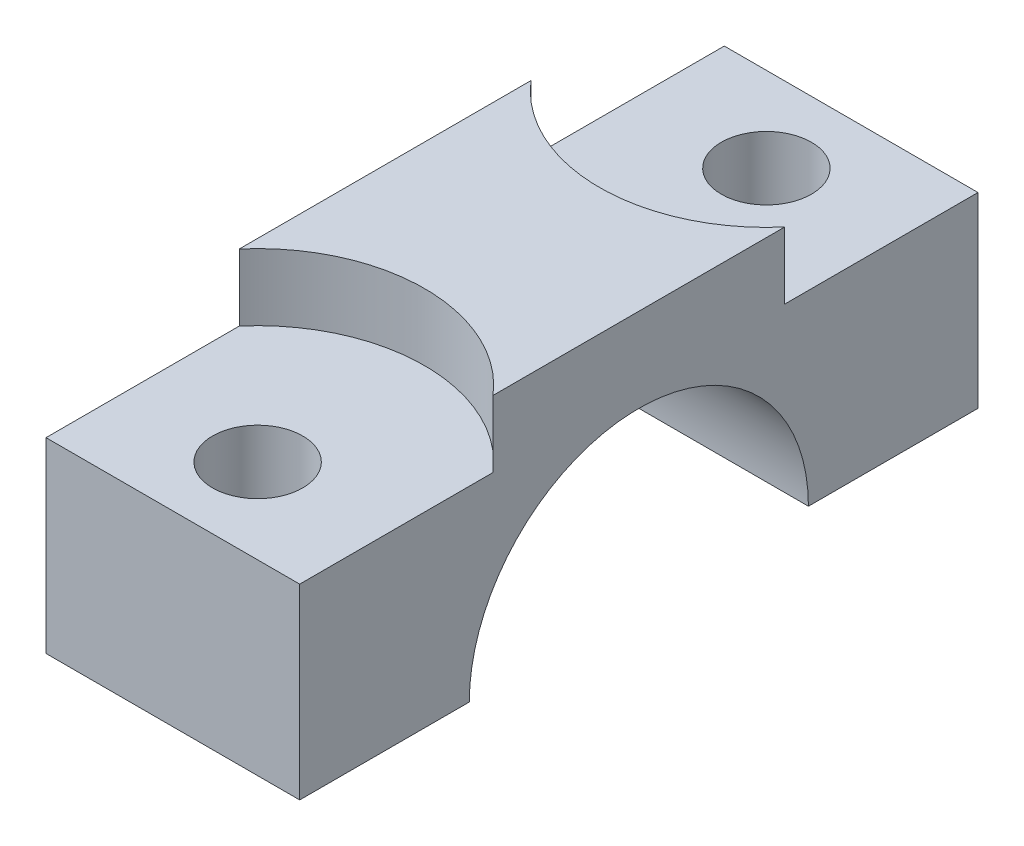
ISO-10303-21;
HEADER;
FILE_DESCRIPTION(('STEP AP214'),'2;1');
FILE_NAME('part.step','',(''),(''),'','','');
FILE_SCHEMA(('AUTOMOTIVE_DESIGN { 1 0 10303 214 1 1 1 1 }'));
ENDSEC;
DATA;
#1=APPLICATION_CONTEXT('core data for automotive mechanical design processes');
#2=APPLICATION_PROTOCOL_DEFINITION('international standard','automotive_design',2000,#1);
#3=PRODUCT_CONTEXT('',#1,'mechanical');
#4=PRODUCT('Part','Part','',(#3));
#5=PRODUCT_RELATED_PRODUCT_CATEGORY('part','',(#4));
#6=PRODUCT_DEFINITION_FORMATION('','',#4);
#7=PRODUCT_DEFINITION_CONTEXT('part definition',#1,'design');
#8=PRODUCT_DEFINITION('design','',#6,#7);
#9=PRODUCT_DEFINITION_SHAPE('','',#8);
#10=(LENGTH_UNIT() NAMED_UNIT(*) SI_UNIT(.MILLI.,.METRE.));
#11=(NAMED_UNIT(*) PLANE_ANGLE_UNIT() SI_UNIT($,.RADIAN.));
#12=(NAMED_UNIT(*) SI_UNIT($,.STERADIAN.) SOLID_ANGLE_UNIT());
#13=UNCERTAINTY_MEASURE_WITH_UNIT(LENGTH_MEASURE(1.E-05),#10,'distance_accuracy_value','');
#14=(GEOMETRIC_REPRESENTATION_CONTEXT(3) GLOBAL_UNCERTAINTY_ASSIGNED_CONTEXT((#13)) GLOBAL_UNIT_ASSIGNED_CONTEXT((#10,
#11,#12)) REPRESENTATION_CONTEXT('',''));
#15=CARTESIAN_POINT('',(0.,0.,0.));
#16=DIRECTION('',(0.,0.,1.));
#17=DIRECTION('',(1.,0.,0.));
#18=AXIS2_PLACEMENT_3D('',#15,#16,#17);
#19=CARTESIAN_POINT('',(9.5,0.,0.));
#20=DIRECTION('',(-1.,0.,0.));
#21=DIRECTION('',(0.,0.,1.));
#22=AXIS2_PLACEMENT_3D('',#19,#20,#21);
#23=CYLINDRICAL_SURFACE('',#22,12.7);
#24=CARTESIAN_POINT('',(-9.5,0.,0.));
#25=DIRECTION('',(1.,0.,0.));
#26=DIRECTION('',(0.,0.,-1.));
#27=AXIS2_PLACEMENT_3D('',#24,#25,#26);
#28=CIRCLE('',#27,12.7);
#29=CARTESIAN_POINT('',(-9.5,0.,-12.7));
#30=VERTEX_POINT('',#29);
#31=CARTESIAN_POINT('',(-9.5,0.,12.7));
#32=VERTEX_POINT('',#31);
#33=EDGE_CURVE('E150',#30,#32,#28,.T.);
#34=ORIENTED_EDGE('',*,*,#33,.F.);
#35=DIRECTION('',(-1.,0.,0.));
#36=VECTOR('',#35,1.);
#37=CARTESIAN_POINT('',(9.5,0.,-12.7));
#38=LINE('',#37,#36);
#39=CARTESIAN_POINT('',(9.5,0.,-12.7));
#40=VERTEX_POINT('',#39);
#41=EDGE_CURVE('E183',#40,#30,#38,.T.);
#42=ORIENTED_EDGE('',*,*,#41,.F.);
#43=CARTESIAN_POINT('',(9.5,0.,0.));
#44=DIRECTION('',(1.,0.,0.));
#45=DIRECTION('',(0.,0.,-1.));
#46=AXIS2_PLACEMENT_3D('',#43,#44,#45);
#47=CIRCLE('',#46,12.7);
#48=CARTESIAN_POINT('',(9.5,0.,12.7));
#49=VERTEX_POINT('',#48);
#50=EDGE_CURVE('E151',#40,#49,#47,.T.);
#51=ORIENTED_EDGE('',*,*,#50,.T.);
#52=DIRECTION('',(-1.,0.,0.));
#53=VECTOR('',#52,1.);
#54=CARTESIAN_POINT('',(9.5,0.,12.7));
#55=LINE('',#54,#53);
#56=EDGE_CURVE('E175',#49,#32,#55,.T.);
#57=ORIENTED_EDGE('',*,*,#56,.T.);
#58=EDGE_LOOP('',(#34,#42,#51,#57));
#59=FACE_BOUND('',#58,.T.);
#60=ADVANCED_FACE('F34',(#59),#23,.F.);
#61=CARTESIAN_POINT('',(9.5,0.,0.));
#62=DIRECTION('',(0.,1.,0.));
#63=DIRECTION('',(0.,0.,1.));
#64=AXIS2_PLACEMENT_3D('',#61,#62,#63);
#65=PLANE('',#64);
#66=CARTESIAN_POINT('',(0.,0.,-19.05));
#67=DIRECTION('',(0.,1.,0.));
#68=DIRECTION('',(0.,0.,1.));
#69=AXIS2_PLACEMENT_3D('',#66,#67,#68);
#70=CIRCLE('',#69,3.375);
#71=CARTESIAN_POINT('',(0.,0.,-15.675));
#72=VERTEX_POINT('',#71);
#73=EDGE_CURVE('E117',#72,#72,#70,.T.);
#74=ORIENTED_EDGE('',*,*,#73,.T.);
#75=EDGE_LOOP('',(#74));
#76=FACE_BOUND('',#75,.T.);
#77=DIRECTION('',(0.,0.,-1.));
#78=VECTOR('',#77,1.);
#79=CARTESIAN_POINT('',(-9.5,0.,0.));
#80=LINE('',#79,#78);
#81=CARTESIAN_POINT('',(-9.5,0.,-25.4));
#82=VERTEX_POINT('',#81);
#83=EDGE_CURVE('E165',#30,#82,#80,.T.);
#84=ORIENTED_EDGE('',*,*,#83,.T.);
#85=DIRECTION('',(-1.,0.,0.));
#86=VECTOR('',#85,1.);
#87=CARTESIAN_POINT('',(9.5,0.,-25.4));
#88=LINE('',#87,#86);
#89=CARTESIAN_POINT('',(9.5,0.,-25.4));
#90=VERTEX_POINT('',#89);
#91=EDGE_CURVE('E180',#90,#82,#88,.T.);
#92=ORIENTED_EDGE('',*,*,#91,.F.);
#93=DIRECTION('',(0.,0.,-1.));
#94=VECTOR('',#93,1.);
#95=CARTESIAN_POINT('',(9.5,0.,0.));
#96=LINE('',#95,#94);
#97=EDGE_CURVE('E154',#40,#90,#96,.T.);
#98=ORIENTED_EDGE('',*,*,#97,.F.);
#99=ORIENTED_EDGE('',*,*,#41,.T.);
#100=EDGE_LOOP('',(#84,#92,#98,#99));
#101=FACE_BOUND('',#100,.T.);
#102=ADVANCED_FACE('F204',(#76,#101),#65,.F.);
#103=CARTESIAN_POINT('',(9.5,0.,-25.4));
#104=DIRECTION('',(0.,0.,-1.));
#105=DIRECTION('',(0.,1.,0.));
#106=AXIS2_PLACEMENT_3D('',#103,#104,#105);
#107=PLANE('',#106);
#108=DIRECTION('',(-1.,0.,0.));
#109=VECTOR('',#108,1.);
#110=CARTESIAN_POINT('',(9.5,14.,-25.4));
#111=LINE('',#110,#109);
#112=CARTESIAN_POINT('',(9.5,14.,-25.4));
#113=VERTEX_POINT('',#112);
#114=CARTESIAN_POINT('',(-9.5,14.,-25.4));
#115=VERTEX_POINT('',#114);
#116=EDGE_CURVE('E116',#113,#115,#111,.T.);
#117=ORIENTED_EDGE('',*,*,#116,.F.);
#118=DIRECTION('',(0.,-1.,0.));
#119=VECTOR('',#118,1.);
#120=CARTESIAN_POINT('',(9.5,0.,-25.4));
#121=LINE('',#120,#119);
#122=EDGE_CURVE('E130',#113,#90,#121,.T.);
#123=ORIENTED_EDGE('',*,*,#122,.T.);
#124=ORIENTED_EDGE('',*,*,#91,.T.);
#125=DIRECTION('',(0.,-1.,0.));
#126=VECTOR('',#125,1.);
#127=CARTESIAN_POINT('',(-9.5,0.,-25.4));
#128=LINE('',#127,#126);
#129=EDGE_CURVE('E168',#115,#82,#128,.T.);
#130=ORIENTED_EDGE('',*,*,#129,.F.);
#131=EDGE_LOOP('',(#117,#123,#124,#130));
#132=FACE_BOUND('',#131,.T.);
#133=ADVANCED_FACE('F224',(#132),#107,.T.);
#134=CARTESIAN_POINT('',(9.5,19.,0.));
#135=DIRECTION('',(0.,1.,0.));
#136=DIRECTION('',(0.,0.,1.));
#137=AXIS2_PLACEMENT_3D('',#134,#135,#136);
#138=PLANE('',#137);
#139=CARTESIAN_POINT('',(0.,19.,-19.05));
#140=DIRECTION('',(0.,1.,0.));
#141=DIRECTION('',(0.,0.,1.));
#142=AXIS2_PLACEMENT_3D('',#139,#140,#141);
#143=CIRCLE('',#142,12.5);
#144=CARTESIAN_POINT('',(-9.5,19.,-10.925961595364));
#145=VERTEX_POINT('',#144);
#146=CARTESIAN_POINT('',(9.5,19.,-10.925961595364));
#147=VERTEX_POINT('',#146);
#148=EDGE_CURVE('E111',#145,#147,#143,.T.);
#149=ORIENTED_EDGE('',*,*,#148,.F.);
#150=DIRECTION('',(0.,0.,-1.));
#151=VECTOR('',#150,1.);
#152=CARTESIAN_POINT('',(-9.5,19.,0.));
#153=LINE('',#152,#151);
#154=CARTESIAN_POINT('',(-9.5,19.,10.925961595364));
#155=VERTEX_POINT('',#154);
#156=EDGE_CURVE('E170',#155,#145,#153,.T.);
#157=ORIENTED_EDGE('',*,*,#156,.F.);
#158=CARTESIAN_POINT('',(0.,19.,19.05));
#159=DIRECTION('',(0.,1.,0.));
#160=DIRECTION('',(0.,0.,1.));
#161=AXIS2_PLACEMENT_3D('',#158,#159,#160);
#162=CIRCLE('',#161,12.5);
#163=CARTESIAN_POINT('',(9.5,19.,10.925961595364));
#164=VERTEX_POINT('',#163);
#165=EDGE_CURVE('E131',#164,#155,#162,.T.);
#166=ORIENTED_EDGE('',*,*,#165,.F.);
#167=DIRECTION('',(0.,0.,-1.));
#168=VECTOR('',#167,1.);
#169=CARTESIAN_POINT('',(9.5,19.,0.));
#170=LINE('',#169,#168);
#171=EDGE_CURVE('E159',#164,#147,#170,.T.);
#172=ORIENTED_EDGE('',*,*,#171,.T.);
#173=EDGE_LOOP('',(#149,#157,#166,#172));
#174=FACE_BOUND('',#173,.T.);
#175=ADVANCED_FACE('F195',(#174),#138,.T.);
#176=CARTESIAN_POINT('',(9.5,0.,25.4));
#177=DIRECTION('',(0.,0.,-1.));
#178=DIRECTION('',(0.,1.,0.));
#179=AXIS2_PLACEMENT_3D('',#176,#177,#178);
#180=PLANE('',#179);
#181=DIRECTION('',(0.,-1.,0.));
#182=VECTOR('',#181,1.);
#183=CARTESIAN_POINT('',(9.5,0.,25.4));
#184=LINE('',#183,#182);
#185=CARTESIAN_POINT('',(9.5,14.,25.4));
#186=VERTEX_POINT('',#185);
#187=CARTESIAN_POINT('',(9.5,0.,25.4));
#188=VERTEX_POINT('',#187);
#189=EDGE_CURVE('E161',#186,#188,#184,.T.);
#190=ORIENTED_EDGE('',*,*,#189,.F.);
#191=DIRECTION('',(-1.,0.,0.));
#192=VECTOR('',#191,1.);
#193=CARTESIAN_POINT('',(9.5,14.,25.4));
#194=LINE('',#193,#192);
#195=CARTESIAN_POINT('',(-9.5,14.,25.4));
#196=VERTEX_POINT('',#195);
#197=EDGE_CURVE('E143',#186,#196,#194,.T.);
#198=ORIENTED_EDGE('',*,*,#197,.T.);
#199=DIRECTION('',(0.,-1.,0.));
#200=VECTOR('',#199,1.);
#201=CARTESIAN_POINT('',(-9.5,0.,25.4));
#202=LINE('',#201,#200);
#203=CARTESIAN_POINT('',(-9.5,0.,25.4));
#204=VERTEX_POINT('',#203);
#205=EDGE_CURVE('E173',#196,#204,#202,.T.);
#206=ORIENTED_EDGE('',*,*,#205,.T.);
#207=DIRECTION('',(-1.,0.,0.));
#208=VECTOR('',#207,1.);
#209=CARTESIAN_POINT('',(9.5,0.,25.4));
#210=LINE('',#209,#208);
#211=EDGE_CURVE('E177',#188,#204,#210,.T.);
#212=ORIENTED_EDGE('',*,*,#211,.F.);
#213=EDGE_LOOP('',(#190,#198,#206,#212));
#214=FACE_BOUND('',#213,.T.);
#215=ADVANCED_FACE('F242',(#214),#180,.F.);
#216=CARTESIAN_POINT('',(0.,0.,19.05));
#217=DIRECTION('',(0.,1.,0.));
#218=DIRECTION('',(0.,0.,1.));
#219=AXIS2_PLACEMENT_3D('',#216,#217,#218);
#220=CIRCLE('',#219,3.375);
#221=CARTESIAN_POINT('',(0.,0.,22.425));
#222=VERTEX_POINT('',#221);
#223=EDGE_CURVE('E140',#222,#222,#220,.T.);
#224=ORIENTED_EDGE('',*,*,#223,.T.);
#225=EDGE_LOOP('',(#224));
#226=FACE_BOUND('',#225,.T.);
#227=EDGE_CURVE('E155',#204,#32,#80,.T.);
#228=ORIENTED_EDGE('',*,*,#227,.T.);
#229=ORIENTED_EDGE('',*,*,#56,.F.);
#230=EDGE_CURVE('E157',#188,#49,#96,.T.);
#231=ORIENTED_EDGE('',*,*,#230,.F.);
#232=ORIENTED_EDGE('',*,*,#211,.T.);
#233=EDGE_LOOP('',(#228,#229,#231,#232));
#234=FACE_BOUND('',#233,.T.);
#235=ADVANCED_FACE('F226',(#226,#234),#65,.F.);
#236=CARTESIAN_POINT('',(9.5,0.,0.));
#237=DIRECTION('',(1.,0.,0.));
#238=DIRECTION('',(0.,0.,-1.));
#239=AXIS2_PLACEMENT_3D('',#236,#237,#238);
#240=PLANE('',#239);
#241=DIRECTION('',(0.,0.,-1.));
#242=VECTOR('',#241,1.);
#243=CARTESIAN_POINT('',(9.5,14.,0.));
#244=LINE('',#243,#242);
#245=CARTESIAN_POINT('',(9.5,14.,-10.925961595364));
#246=VERTEX_POINT('',#245);
#247=EDGE_CURVE('E122',#246,#113,#244,.T.);
#248=ORIENTED_EDGE('',*,*,#247,.F.);
#249=DIRECTION('',(0.,1.,0.));
#250=VECTOR('',#249,1.);
#251=CARTESIAN_POINT('',(9.5,19.,-10.925961595364));
#252=LINE('',#251,#250);
#253=EDGE_CURVE('E108',#147,#246,#252,.F.);
#254=ORIENTED_EDGE('',*,*,#253,.F.);
#255=ORIENTED_EDGE('',*,*,#171,.F.);
#256=DIRECTION('',(0.,1.,0.));
#257=VECTOR('',#256,1.);
#258=CARTESIAN_POINT('',(9.5,19.,10.925961595364));
#259=LINE('',#258,#257);
#260=CARTESIAN_POINT('',(9.5,14.,10.925961595364));
#261=VERTEX_POINT('',#260);
#262=EDGE_CURVE('E148',#261,#164,#259,.T.);
#263=ORIENTED_EDGE('',*,*,#262,.F.);
#264=DIRECTION('',(0.,0.,-1.));
#265=VECTOR('',#264,1.);
#266=CARTESIAN_POINT('',(9.5,14.,0.));
#267=LINE('',#266,#265);
#268=EDGE_CURVE('E146',#186,#261,#267,.T.);
#269=ORIENTED_EDGE('',*,*,#268,.F.);
#270=ORIENTED_EDGE('',*,*,#189,.T.);
#271=ORIENTED_EDGE('',*,*,#230,.T.);
#272=ORIENTED_EDGE('',*,*,#50,.F.);
#273=ORIENTED_EDGE('',*,*,#97,.T.);
#274=ORIENTED_EDGE('',*,*,#122,.F.);
#275=EDGE_LOOP('',(#248,#254,#255,#263,#269,#270,#271,#272,#273,#274));
#276=FACE_BOUND('',#275,.T.);
#277=ADVANCED_FACE('F128',(#276),#240,.T.);
#278=CARTESIAN_POINT('',(-9.5,0.,0.));
#279=DIRECTION('',(1.,0.,0.));
#280=DIRECTION('',(0.,0.,-1.));
#281=AXIS2_PLACEMENT_3D('',#278,#279,#280);
#282=PLANE('',#281);
#283=DIRECTION('',(0.,1.,0.));
#284=VECTOR('',#283,1.);
#285=CARTESIAN_POINT('',(-9.5,19.,-10.925961595364));
#286=LINE('',#285,#284);
#287=CARTESIAN_POINT('',(-9.5,14.,-10.925961595364));
#288=VERTEX_POINT('',#287);
#289=EDGE_CURVE('E41',#145,#288,#286,.F.);
#290=ORIENTED_EDGE('',*,*,#289,.T.);
#291=DIRECTION('',(0.,0.,-1.));
#292=VECTOR('',#291,1.);
#293=CARTESIAN_POINT('',(-9.5,14.,0.));
#294=LINE('',#293,#292);
#295=EDGE_CURVE('E11',#288,#115,#294,.T.);
#296=ORIENTED_EDGE('',*,*,#295,.T.);
#297=ORIENTED_EDGE('',*,*,#129,.T.);
#298=ORIENTED_EDGE('',*,*,#83,.F.);
#299=ORIENTED_EDGE('',*,*,#33,.T.);
#300=ORIENTED_EDGE('',*,*,#227,.F.);
#301=ORIENTED_EDGE('',*,*,#205,.F.);
#302=DIRECTION('',(0.,0.,-1.));
#303=VECTOR('',#302,1.);
#304=CARTESIAN_POINT('',(-9.5,14.,0.));
#305=LINE('',#304,#303);
#306=CARTESIAN_POINT('',(-9.5,14.,10.925961595364));
#307=VERTEX_POINT('',#306);
#308=EDGE_CURVE('E185',#196,#307,#305,.T.);
#309=ORIENTED_EDGE('',*,*,#308,.T.);
#310=DIRECTION('',(0.,1.,0.));
#311=VECTOR('',#310,1.);
#312=CARTESIAN_POINT('',(-9.5,19.,10.925961595364));
#313=LINE('',#312,#311);
#314=EDGE_CURVE('E188',#307,#155,#313,.T.);
#315=ORIENTED_EDGE('',*,*,#314,.T.);
#316=ORIENTED_EDGE('',*,*,#156,.T.);
#317=EDGE_LOOP('',(#290,#296,#297,#298,#299,#300,#301,#309,#315,#316));
#318=FACE_BOUND('',#317,.T.);
#319=ADVANCED_FACE('F191',(#318),#282,.F.);
#320=CARTESIAN_POINT('',(0.,19.,19.05));
#321=DIRECTION('',(0.,1.,0.));
#322=DIRECTION('',(0.,0.,1.));
#323=AXIS2_PLACEMENT_3D('',#320,#321,#322);
#324=CYLINDRICAL_SURFACE('',#323,3.375);
#325=ORIENTED_EDGE('',*,*,#223,.F.);
#326=EDGE_LOOP('',(#325));
#327=FACE_BOUND('',#326,.T.);
#328=CARTESIAN_POINT('',(0.,14.,19.05));
#329=DIRECTION('',(0.,1.,0.));
#330=DIRECTION('',(0.,0.,1.));
#331=AXIS2_PLACEMENT_3D('',#328,#329,#330);
#332=CIRCLE('',#331,3.375);
#333=CARTESIAN_POINT('',(0.,14.,22.425));
#334=VERTEX_POINT('',#333);
#335=EDGE_CURVE('E137',#334,#334,#332,.T.);
#336=ORIENTED_EDGE('',*,*,#335,.T.);
#337=EDGE_LOOP('',(#336));
#338=FACE_BOUND('',#337,.T.);
#339=ADVANCED_FACE('F252',(#327,#338),#324,.F.);
#340=CARTESIAN_POINT('',(3.375,14.,19.05));
#341=DIRECTION('',(0.,-1.,0.));
#342=DIRECTION('',(0.,0.,-1.));
#343=AXIS2_PLACEMENT_3D('',#340,#341,#342);
#344=PLANE('',#343);
#345=ORIENTED_EDGE('',*,*,#268,.T.);
#346=CARTESIAN_POINT('',(0.,14.,19.05));
#347=DIRECTION('',(0.,1.,0.));
#348=DIRECTION('',(0.,0.,1.));
#349=AXIS2_PLACEMENT_3D('',#346,#347,#348);
#350=CIRCLE('',#349,12.5);
#351=EDGE_CURVE('E56',#261,#307,#350,.T.);
#352=ORIENTED_EDGE('',*,*,#351,.T.);
#353=ORIENTED_EDGE('',*,*,#308,.F.);
#354=ORIENTED_EDGE('',*,*,#197,.F.);
#355=EDGE_LOOP('',(#345,#352,#353,#354));
#356=FACE_BOUND('',#355,.T.);
#357=ORIENTED_EDGE('',*,*,#335,.F.);
#358=EDGE_LOOP('',(#357));
#359=FACE_BOUND('',#358,.T.);
#360=ADVANCED_FACE('F243',(#356,#359),#344,.F.);
#361=CARTESIAN_POINT('',(0.,19.,19.05));
#362=DIRECTION('',(0.,1.,0.));
#363=DIRECTION('',(0.,0.,1.));
#364=AXIS2_PLACEMENT_3D('',#361,#362,#363);
#365=CYLINDRICAL_SURFACE('',#364,12.5);
#366=ORIENTED_EDGE('',*,*,#262,.T.);
#367=ORIENTED_EDGE('',*,*,#165,.T.);
#368=ORIENTED_EDGE('',*,*,#314,.F.);
#369=ORIENTED_EDGE('',*,*,#351,.F.);
#370=EDGE_LOOP('',(#366,#367,#368,#369));
#371=FACE_BOUND('',#370,.T.);
#372=ADVANCED_FACE('F210',(#371),#365,.F.);
#373=CARTESIAN_POINT('',(0.,19.,-19.05));
#374=DIRECTION('',(0.,1.,0.));
#375=DIRECTION('',(0.,0.,1.));
#376=AXIS2_PLACEMENT_3D('',#373,#374,#375);
#377=CYLINDRICAL_SURFACE('',#376,3.375);
#378=ORIENTED_EDGE('',*,*,#73,.F.);
#379=EDGE_LOOP('',(#378));
#380=FACE_BOUND('',#379,.T.);
#381=CARTESIAN_POINT('',(0.,14.,-19.05));
#382=DIRECTION('',(0.,1.,0.));
#383=DIRECTION('',(0.,0.,1.));
#384=AXIS2_PLACEMENT_3D('',#381,#382,#383);
#385=CIRCLE('',#384,3.375);
#386=CARTESIAN_POINT('',(0.,14.,-15.675));
#387=VERTEX_POINT('',#386);
#388=EDGE_CURVE('E125',#387,#387,#385,.T.);
#389=ORIENTED_EDGE('',*,*,#388,.T.);
#390=EDGE_LOOP('',(#389));
#391=FACE_BOUND('',#390,.T.);
#392=ADVANCED_FACE('F207',(#380,#391),#377,.F.);
#393=CARTESIAN_POINT('',(3.375,14.,-19.05));
#394=DIRECTION('',(0.,-1.,0.));
#395=DIRECTION('',(0.,0.,-1.));
#396=AXIS2_PLACEMENT_3D('',#393,#394,#395);
#397=PLANE('',#396);
#398=ORIENTED_EDGE('',*,*,#247,.T.);
#399=ORIENTED_EDGE('',*,*,#116,.T.);
#400=ORIENTED_EDGE('',*,*,#295,.F.);
#401=CARTESIAN_POINT('',(0.,14.,-19.05));
#402=DIRECTION('',(0.,1.,0.));
#403=DIRECTION('',(0.,0.,1.));
#404=AXIS2_PLACEMENT_3D('',#401,#402,#403);
#405=CIRCLE('',#404,12.5);
#406=EDGE_CURVE('E48',#288,#246,#405,.T.);
#407=ORIENTED_EDGE('',*,*,#406,.T.);
#408=EDGE_LOOP('',(#398,#399,#400,#407));
#409=FACE_BOUND('',#408,.T.);
#410=ORIENTED_EDGE('',*,*,#388,.F.);
#411=EDGE_LOOP('',(#410));
#412=FACE_BOUND('',#411,.T.);
#413=ADVANCED_FACE('F120',(#409,#412),#397,.F.);
#414=CARTESIAN_POINT('',(0.,19.,-19.05));
#415=DIRECTION('',(0.,1.,0.));
#416=DIRECTION('',(0.,0.,1.));
#417=AXIS2_PLACEMENT_3D('',#414,#415,#416);
#418=CYLINDRICAL_SURFACE('',#417,12.5);
#419=ORIENTED_EDGE('',*,*,#253,.T.);
#420=ORIENTED_EDGE('',*,*,#406,.F.);
#421=ORIENTED_EDGE('',*,*,#289,.F.);
#422=ORIENTED_EDGE('',*,*,#148,.T.);
#423=EDGE_LOOP('',(#419,#420,#421,#422));
#424=FACE_BOUND('',#423,.T.);
#425=ADVANCED_FACE('F109',(#424),#418,.F.);
#426=CLOSED_SHELL('',(#60,#102,#133,#175,#215,#235,#277,#319,#339,#360,#372,#392,#413,#425));
#427=MANIFOLD_SOLID_BREP('B2',#426);
#428=ADVANCED_BREP_SHAPE_REPRESENTATION('',(#18,#427),#14);
#429=SHAPE_DEFINITION_REPRESENTATION(#9,#428);
ENDSEC;
END-ISO-10303-21;
